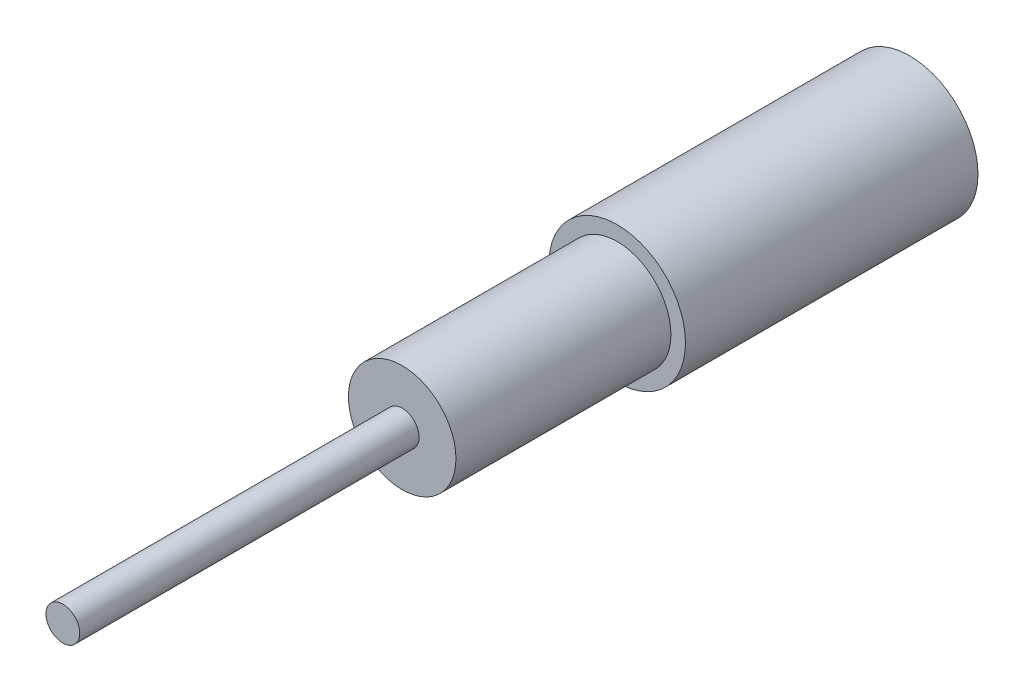
ISO-10303-21;
HEADER;
FILE_DESCRIPTION(('STEP AP214'),'2;1');
FILE_NAME('part.step','',(''),(''),'','','');
FILE_SCHEMA(('AUTOMOTIVE_DESIGN { 1 0 10303 214 1 1 1 1 }'));
ENDSEC;
DATA;
#1=APPLICATION_CONTEXT('core data for automotive mechanical design processes');
#2=APPLICATION_PROTOCOL_DEFINITION('international standard','automotive_design',2000,#1);
#3=PRODUCT_CONTEXT('',#1,'mechanical');
#4=PRODUCT('Part','Part','',(#3));
#5=PRODUCT_RELATED_PRODUCT_CATEGORY('part','',(#4));
#6=PRODUCT_DEFINITION_FORMATION('','',#4);
#7=PRODUCT_DEFINITION_CONTEXT('part definition',#1,'design');
#8=PRODUCT_DEFINITION('design','',#6,#7);
#9=PRODUCT_DEFINITION_SHAPE('','',#8);
#10=(LENGTH_UNIT() NAMED_UNIT(*) SI_UNIT(.MILLI.,.METRE.));
#11=(NAMED_UNIT(*) PLANE_ANGLE_UNIT() SI_UNIT($,.RADIAN.));
#12=(NAMED_UNIT(*) SI_UNIT($,.STERADIAN.) SOLID_ANGLE_UNIT());
#13=UNCERTAINTY_MEASURE_WITH_UNIT(LENGTH_MEASURE(1.E-05),#10,'distance_accuracy_value','');
#14=(GEOMETRIC_REPRESENTATION_CONTEXT(3) GLOBAL_UNCERTAINTY_ASSIGNED_CONTEXT((#13)) GLOBAL_UNIT_ASSIGNED_CONTEXT((#10,
#11,#12)) REPRESENTATION_CONTEXT('',''));
#15=CARTESIAN_POINT('',(0.,0.,0.));
#16=DIRECTION('',(0.,0.,1.));
#17=DIRECTION('',(1.,0.,0.));
#18=AXIS2_PLACEMENT_3D('',#15,#16,#17);
#19=CARTESIAN_POINT('',(140.996079659607,0.,154.3));
#20=DIRECTION('',(0.,0.,1.));
#21=DIRECTION('',(1.,0.,0.));
#22=AXIS2_PLACEMENT_3D('',#19,#20,#21);
#23=PLANE('',#22);
#24=CARTESIAN_POINT('',(140.996079659607,0.,154.3));
#25=DIRECTION('',(0.,0.,1.));
#26=DIRECTION('',(1.,0.,0.));
#27=AXIS2_PLACEMENT_3D('',#24,#25,#26);
#28=CIRCLE('',#27,2.2);
#29=CARTESIAN_POINT('',(143.196079659607,0.,154.3));
#30=VERTEX_POINT('',#29);
#31=EDGE_CURVE('E18',#30,#30,#28,.F.);
#32=ORIENTED_EDGE('',*,*,#31,.F.);
#33=EDGE_LOOP('',(#32));
#34=FACE_BOUND('',#33,.T.);
#35=ADVANCED_FACE('F15',(#34),#23,.T.);
#36=CARTESIAN_POINT('',(140.996079659607,0.,110.1));
#37=DIRECTION('',(0.,0.,1.));
#38=DIRECTION('',(1.,0.,0.));
#39=AXIS2_PLACEMENT_3D('',#36,#37,#38);
#40=CYLINDRICAL_SURFACE('',#39,2.2);
#41=CARTESIAN_POINT('',(140.996079659607,0.,110.1));
#42=DIRECTION('',(0.,0.,1.));
#43=DIRECTION('',(1.,0.,0.));
#44=AXIS2_PLACEMENT_3D('',#41,#42,#43);
#45=CIRCLE('',#44,2.2);
#46=CARTESIAN_POINT('',(143.196079659607,0.,110.1));
#47=VERTEX_POINT('',#46);
#48=EDGE_CURVE('E34',#47,#47,#45,.F.);
#49=ORIENTED_EDGE('',*,*,#48,.F.);
#50=EDGE_LOOP('',(#49));
#51=FACE_BOUND('',#50,.T.);
#52=ORIENTED_EDGE('',*,*,#31,.T.);
#53=EDGE_LOOP('',(#52));
#54=FACE_BOUND('',#53,.T.);
#55=ADVANCED_FACE('F41',(#51,#54),#40,.T.);
#56=CARTESIAN_POINT('',(140.996079659607,0.,110.1));
#57=DIRECTION('',(0.,0.,1.));
#58=DIRECTION('',(1.,0.,0.));
#59=AXIS2_PLACEMENT_3D('',#56,#57,#58);
#60=PLANE('',#59);
#61=CARTESIAN_POINT('',(140.996079659607,0.,110.1));
#62=DIRECTION('',(0.,0.,1.));
#63=DIRECTION('',(1.,0.,0.));
#64=AXIS2_PLACEMENT_3D('',#61,#62,#63);
#65=CIRCLE('',#64,7.);
#66=CARTESIAN_POINT('',(147.996079659607,0.,110.1));
#67=VERTEX_POINT('',#66);
#68=EDGE_CURVE('E32',#67,#67,#65,.F.);
#69=ORIENTED_EDGE('',*,*,#68,.F.);
#70=EDGE_LOOP('',(#69));
#71=FACE_BOUND('',#70,.T.);
#72=ORIENTED_EDGE('',*,*,#48,.T.);
#73=EDGE_LOOP('',(#72));
#74=FACE_BOUND('',#73,.T.);
#75=ADVANCED_FACE('F48',(#71,#74),#60,.T.);
#76=CARTESIAN_POINT('',(140.996079659607,0.,82.1));
#77=DIRECTION('',(0.,0.,1.));
#78=DIRECTION('',(1.,0.,0.));
#79=AXIS2_PLACEMENT_3D('',#76,#77,#78);
#80=CYLINDRICAL_SURFACE('',#79,7.);
#81=CARTESIAN_POINT('',(140.996079659607,0.,82.1));
#82=DIRECTION('',(0.,0.,1.));
#83=DIRECTION('',(1.,0.,0.));
#84=AXIS2_PLACEMENT_3D('',#81,#82,#83);
#85=CIRCLE('',#84,7.);
#86=CARTESIAN_POINT('',(147.996079659607,0.,82.1));
#87=VERTEX_POINT('',#86);
#88=EDGE_CURVE('E27',#87,#87,#85,.F.);
#89=ORIENTED_EDGE('',*,*,#88,.F.);
#90=EDGE_LOOP('',(#89));
#91=FACE_BOUND('',#90,.T.);
#92=ORIENTED_EDGE('',*,*,#68,.T.);
#93=EDGE_LOOP('',(#92));
#94=FACE_BOUND('',#93,.T.);
#95=ADVANCED_FACE('F64',(#91,#94),#80,.T.);
#96=CARTESIAN_POINT('',(149.433579659607,0.,82.1));
#97=DIRECTION('',(0.,0.,1.));
#98=DIRECTION('',(1.,0.,0.));
#99=AXIS2_PLACEMENT_3D('',#96,#97,#98);
#100=PLANE('',#99);
#101=ORIENTED_EDGE('',*,*,#88,.T.);
#102=EDGE_LOOP('',(#101));
#103=FACE_BOUND('',#102,.T.);
#104=CARTESIAN_POINT('',(140.996079659607,0.,82.1));
#105=DIRECTION('',(0.,0.,1.));
#106=DIRECTION('',(1.,0.,0.));
#107=AXIS2_PLACEMENT_3D('',#104,#105,#106);
#108=CIRCLE('',#107,8.9);
#109=CARTESIAN_POINT('',(149.896079659607,0.,82.1));
#110=VERTEX_POINT('',#109);
#111=EDGE_CURVE('E22',#110,#110,#108,.F.);
#112=ORIENTED_EDGE('',*,*,#111,.F.);
#113=EDGE_LOOP('',(#112));
#114=FACE_BOUND('',#113,.T.);
#115=ADVANCED_FACE('F57',(#103,#114),#100,.T.);
#116=CARTESIAN_POINT('',(149.433579659607,0.,44.));
#117=DIRECTION('',(0.,0.,1.));
#118=DIRECTION('',(1.,0.,0.));
#119=AXIS2_PLACEMENT_3D('',#116,#117,#118);
#120=PLANE('',#119);
#121=CARTESIAN_POINT('',(140.996079659607,0.,44.));
#122=DIRECTION('',(0.,0.,1.));
#123=DIRECTION('',(1.,0.,0.));
#124=AXIS2_PLACEMENT_3D('',#121,#122,#123);
#125=CIRCLE('',#124,8.9);
#126=CARTESIAN_POINT('',(149.896079659607,0.,44.));
#127=VERTEX_POINT('',#126);
#128=EDGE_CURVE('E10',#127,#127,#125,.T.);
#129=ORIENTED_EDGE('',*,*,#128,.F.);
#130=EDGE_LOOP('',(#129));
#131=FACE_BOUND('',#130,.T.);
#132=ADVANCED_FACE('F52',(#131),#120,.F.);
#133=CARTESIAN_POINT('',(140.996079659607,0.,44.));
#134=DIRECTION('',(0.,0.,1.));
#135=DIRECTION('',(1.,0.,0.));
#136=AXIS2_PLACEMENT_3D('',#133,#134,#135);
#137=CYLINDRICAL_SURFACE('',#136,8.9);
#138=ORIENTED_EDGE('',*,*,#128,.T.);
#139=EDGE_LOOP('',(#138));
#140=FACE_BOUND('',#139,.T.);
#141=ORIENTED_EDGE('',*,*,#111,.T.);
#142=EDGE_LOOP('',(#141));
#143=FACE_BOUND('',#142,.T.);
#144=ADVANCED_FACE('F50',(#140,#143),#137,.T.);
#145=CLOSED_SHELL('',(#35,#55,#75,#95,#115,#132,#144));
#146=MANIFOLD_SOLID_BREP('B1',#145);
#147=ADVANCED_BREP_SHAPE_REPRESENTATION('',(#18,#146),#14);
#148=SHAPE_DEFINITION_REPRESENTATION(#9,#147);
ENDSEC;
END-ISO-10303-21;
